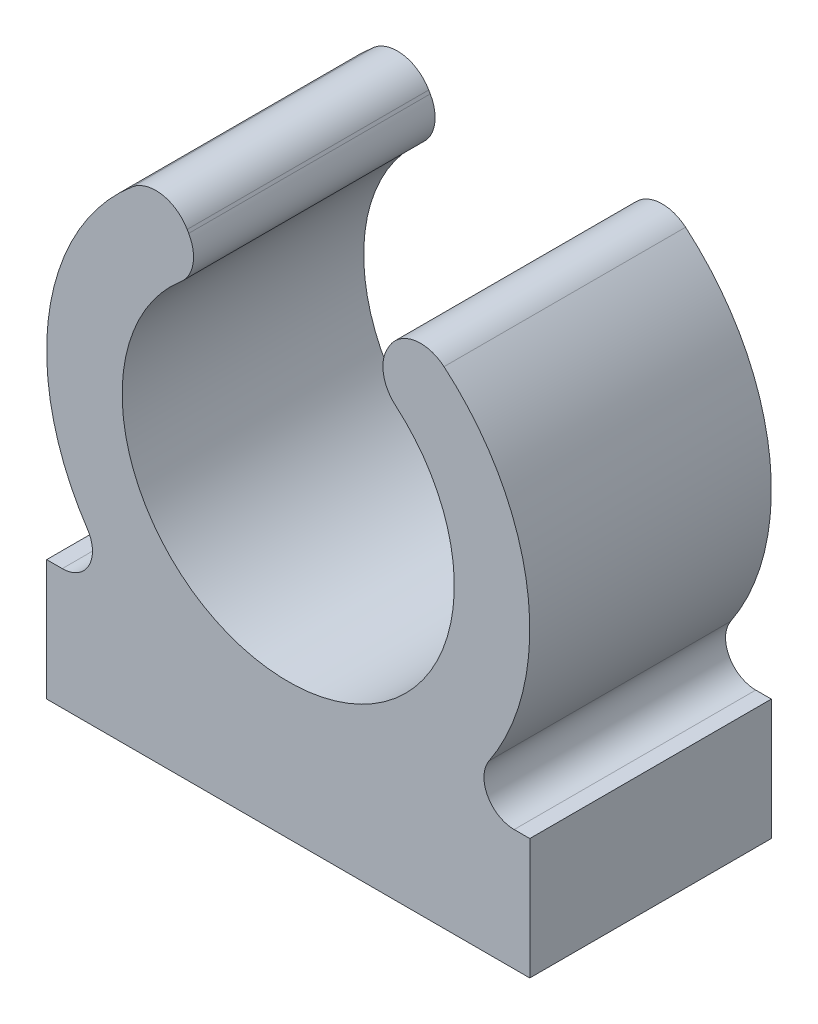
ISO-10303-21;
HEADER;
FILE_DESCRIPTION(('STEP AP214'),'2;1');
FILE_NAME('part.step','',(''),(''),'','','');
FILE_SCHEMA(('AUTOMOTIVE_DESIGN { 1 0 10303 214 1 1 1 1 }'));
ENDSEC;
DATA;
#1=APPLICATION_CONTEXT('core data for automotive mechanical design processes');
#2=APPLICATION_PROTOCOL_DEFINITION('international standard','automotive_design',2000,#1);
#3=PRODUCT_CONTEXT('',#1,'mechanical');
#4=PRODUCT('Part','Part','',(#3));
#5=PRODUCT_RELATED_PRODUCT_CATEGORY('part','',(#4));
#6=PRODUCT_DEFINITION_FORMATION('','',#4);
#7=PRODUCT_DEFINITION_CONTEXT('part definition',#1,'design');
#8=PRODUCT_DEFINITION('design','',#6,#7);
#9=PRODUCT_DEFINITION_SHAPE('','',#8);
#10=(LENGTH_UNIT() NAMED_UNIT(*) SI_UNIT(.MILLI.,.METRE.));
#11=(NAMED_UNIT(*) PLANE_ANGLE_UNIT() SI_UNIT($,.RADIAN.));
#12=(NAMED_UNIT(*) SI_UNIT($,.STERADIAN.) SOLID_ANGLE_UNIT());
#13=UNCERTAINTY_MEASURE_WITH_UNIT(LENGTH_MEASURE(1.E-05),#10,'distance_accuracy_value','');
#14=(GEOMETRIC_REPRESENTATION_CONTEXT(3) GLOBAL_UNCERTAINTY_ASSIGNED_CONTEXT((#13)) GLOBAL_UNIT_ASSIGNED_CONTEXT((#10,
#11,#12)) REPRESENTATION_CONTEXT('',''));
#15=CARTESIAN_POINT('',(0.,0.,0.));
#16=DIRECTION('',(0.,0.,1.));
#17=DIRECTION('',(1.,0.,0.));
#18=AXIS2_PLACEMENT_3D('',#15,#16,#17);
#19=CARTESIAN_POINT('',(0.,2.,0.));
#20=DIRECTION('',(0.,-1.,0.));
#21=DIRECTION('',(0.,0.,-1.));
#22=AXIS2_PLACEMENT_3D('',#19,#20,#21);
#23=PLANE('',#22);
#24=DIRECTION('',(-1.,0.,0.));
#25=VECTOR('',#24,1.);
#26=CARTESIAN_POINT('',(0.,2.,-4.));
#27=LINE('',#26,#25);
#28=CARTESIAN_POINT('',(8.,2.,-4.));
#29=VERTEX_POINT('',#28);
#30=CARTESIAN_POINT('',(7.74165738677394,2.,-4.));
#31=VERTEX_POINT('',#30);
#32=EDGE_CURVE('E251',#29,#31,#27,.T.);
#33=ORIENTED_EDGE('',*,*,#32,.T.);
#34=DIRECTION('',(0.,0.,1.));
#35=VECTOR('',#34,1.);
#36=CARTESIAN_POINT('',(7.74165738677394,2.,0.));
#37=LINE('',#36,#35);
#38=CARTESIAN_POINT('',(7.74165738677394,2.,0.));
#39=VERTEX_POINT('',#38);
#40=EDGE_CURVE('E291',#31,#39,#37,.T.);
#41=ORIENTED_EDGE('',*,*,#40,.T.);
#42=DIRECTION('',(1.,0.,0.));
#43=VECTOR('',#42,1.);
#44=CARTESIAN_POINT('',(0.,2.,0.));
#45=LINE('',#44,#43);
#46=CARTESIAN_POINT('',(8.,2.,0.));
#47=VERTEX_POINT('',#46);
#48=EDGE_CURVE('E241',#39,#47,#45,.T.);
#49=ORIENTED_EDGE('',*,*,#48,.T.);
#50=DIRECTION('',(0.,0.,-1.));
#51=VECTOR('',#50,1.);
#52=CARTESIAN_POINT('',(8.,2.,0.));
#53=LINE('',#52,#51);
#54=EDGE_CURVE('E246',#47,#29,#53,.T.);
#55=ORIENTED_EDGE('',*,*,#54,.T.);
#56=EDGE_LOOP('',(#33,#41,#49,#55));
#57=FACE_BOUND('',#56,.T.);
#58=ADVANCED_FACE('F47',(#57),#23,.F.);
#59=CARTESIAN_POINT('',(0.,1.,0.));
#60=DIRECTION('',(1.,0.,0.));
#61=DIRECTION('',(0.,0.,-1.));
#62=AXIS2_PLACEMENT_3D('',#59,#60,#61);
#63=PLANE('',#62);
#64=DIRECTION('',(0.,0.,1.));
#65=VECTOR('',#64,1.);
#66=CARTESIAN_POINT('',(0.,0.,0.));
#67=LINE('',#66,#65);
#68=CARTESIAN_POINT('',(0.,0.,-4.));
#69=VERTEX_POINT('',#68);
#70=CARTESIAN_POINT('',(0.,0.,0.));
#71=VERTEX_POINT('',#70);
#72=EDGE_CURVE('E255',#69,#71,#67,.T.);
#73=ORIENTED_EDGE('',*,*,#72,.T.);
#74=DIRECTION('',(0.,-1.,0.));
#75=VECTOR('',#74,1.);
#76=CARTESIAN_POINT('',(0.,1.,0.));
#77=LINE('',#76,#75);
#78=CARTESIAN_POINT('',(0.,2.,0.));
#79=VERTEX_POINT('',#78);
#80=EDGE_CURVE('E280',#79,#71,#77,.T.);
#81=ORIENTED_EDGE('',*,*,#80,.F.);
#82=DIRECTION('',(0.,0.,1.));
#83=VECTOR('',#82,1.);
#84=CARTESIAN_POINT('',(0.,2.,0.));
#85=LINE('',#84,#83);
#86=CARTESIAN_POINT('',(0.,2.,-4.));
#87=VERTEX_POINT('',#86);
#88=EDGE_CURVE('E237',#87,#79,#85,.T.);
#89=ORIENTED_EDGE('',*,*,#88,.F.);
#90=DIRECTION('',(0.,-1.,0.));
#91=VECTOR('',#90,1.);
#92=CARTESIAN_POINT('',(0.,1.,-4.));
#93=LINE('',#92,#91);
#94=EDGE_CURVE('E268',#87,#69,#93,.T.);
#95=ORIENTED_EDGE('',*,*,#94,.T.);
#96=EDGE_LOOP('',(#73,#81,#89,#95));
#97=FACE_BOUND('',#96,.T.);
#98=ADVANCED_FACE('F367',(#97),#63,.F.);
#99=CARTESIAN_POINT('',(0.,1.,0.));
#100=DIRECTION('',(0.,0.,-1.));
#101=DIRECTION('',(-1.,0.,0.));
#102=AXIS2_PLACEMENT_3D('',#99,#100,#101);
#103=PLANE('',#102);
#104=ORIENTED_EDGE('',*,*,#48,.F.);
#105=CARTESIAN_POINT('',(7.74165738677394,2.5,0.));
#106=DIRECTION('',(0.,0.,-1.));
#107=DIRECTION('',(-1.,0.,0.));
#108=AXIS2_PLACEMENT_3D('',#105,#106,#107);
#109=CIRCLE('',#108,0.5);
#110=CARTESIAN_POINT('',(7.32591767713239,2.77777777777778,0.));
#111=VERTEX_POINT('',#110);
#112=EDGE_CURVE('E56',#39,#111,#109,.T.);
#113=ORIENTED_EDGE('',*,*,#112,.T.);
#114=CARTESIAN_POINT('',(4.,5.,0.));
#115=DIRECTION('',(0.,0.,1.));
#116=DIRECTION('',(1.,0.,0.));
#117=AXIS2_PLACEMENT_3D('',#114,#115,#116);
#118=CIRCLE('',#117,4.);
#119=CARTESIAN_POINT('',(6.5799238768692,8.05679452851516,0.));
#120=VERTEX_POINT('',#119);
#121=EDGE_CURVE('E197',#111,#120,#118,.T.);
#122=ORIENTED_EDGE('',*,*,#121,.T.);
#123=CARTESIAN_POINT('',(6.19293529533882,7.59827534923789,0.));
#124=DIRECTION('',(0.,0.,1.));
#125=DIRECTION('',(1.,0.,0.));
#126=AXIS2_PLACEMENT_3D('',#123,#124,#125);
#127=CIRCLE('',#126,0.599999999999999);
#128=CARTESIAN_POINT('',(5.67332005306815,7.89827534923789,0.));
#129=VERTEX_POINT('',#128);
#130=EDGE_CURVE('E202',#129,#120,#127,.F.);
#131=ORIENTED_EDGE('',*,*,#130,.F.);
#132=DIRECTION('',(0.499999999999986,0.866025403784447,0.));
#133=VECTOR('',#132,1.);
#134=CARTESIAN_POINT('',(0.834936490539053,-0.482050807568945,0.));
#135=LINE('',#134,#133);
#136=CARTESIAN_POINT('',(5.6479153497677,7.85427311237029,0.));
#137=VERTEX_POINT('',#136);
#138=EDGE_CURVE('E206',#137,#129,#135,.T.);
#139=ORIENTED_EDGE('',*,*,#138,.F.);
#140=CARTESIAN_POINT('',(6.16753059203837,7.55427311237029,0.));
#141=DIRECTION('',(0.,0.,1.));
#142=DIRECTION('',(1.,0.,0.));
#143=AXIS2_PLACEMENT_3D('',#140,#141,#142);
#144=CIRCLE('',#143,0.599999999999999);
#145=CARTESIAN_POINT('',(5.77931615764343,7.09679136090098,0.));
#146=VERTEX_POINT('',#145);
#147=EDGE_CURVE('E173',#137,#146,#144,.T.);
#148=ORIENTED_EDGE('',*,*,#147,.T.);
#149=CARTESIAN_POINT('',(4.,5.,0.));
#150=DIRECTION('',(0.,0.,1.));
#151=DIRECTION('',(1.,0.,0.));
#152=AXIS2_PLACEMENT_3D('',#149,#150,#151);
#153=CIRCLE('',#152,2.75);
#154=CARTESIAN_POINT('',(2.22068384235657,7.09679136090098,0.));
#155=VERTEX_POINT('',#154);
#156=EDGE_CURVE('E165',#155,#146,#153,.T.);
#157=ORIENTED_EDGE('',*,*,#156,.F.);
#158=CARTESIAN_POINT('',(1.83246940796163,7.55427311237029,0.));
#159=DIRECTION('',(0.,0.,1.));
#160=DIRECTION('',(1.,0.,0.));
#161=AXIS2_PLACEMENT_3D('',#158,#159,#160);
#162=CIRCLE('',#161,0.6);
#163=CARTESIAN_POINT('',(2.3520846502323,7.85427311237029,0.));
#164=VERTEX_POINT('',#163);
#165=EDGE_CURVE('E178',#155,#164,#162,.T.);
#166=ORIENTED_EDGE('',*,*,#165,.T.);
#167=DIRECTION('',(-0.499999999999986,0.866025403784447,0.));
#168=VECTOR('',#167,1.);
#169=CARTESIAN_POINT('',(5.16506350946106,2.98205080756874,0.));
#170=LINE('',#169,#168);
#171=CARTESIAN_POINT('',(2.32667994693185,7.89827534923789,0.));
#172=VERTEX_POINT('',#171);
#173=EDGE_CURVE('E187',#164,#172,#170,.T.);
#174=ORIENTED_EDGE('',*,*,#173,.T.);
#175=CARTESIAN_POINT('',(1.80706470466118,7.59827534923789,0.));
#176=DIRECTION('',(0.,0.,1.));
#177=DIRECTION('',(1.,0.,0.));
#178=AXIS2_PLACEMENT_3D('',#175,#176,#177);
#179=CIRCLE('',#178,0.599999999999999);
#180=CARTESIAN_POINT('',(1.4200761231308,8.05679452851516,0.));
#181=VERTEX_POINT('',#180);
#182=EDGE_CURVE('E190',#172,#181,#179,.T.);
#183=ORIENTED_EDGE('',*,*,#182,.T.);
#184=CARTESIAN_POINT('',(0.674082322867607,2.77777777777778,0.));
#185=VERTEX_POINT('',#184);
#186=EDGE_CURVE('E198',#181,#185,#118,.T.);
#187=ORIENTED_EDGE('',*,*,#186,.T.);
#188=CARTESIAN_POINT('',(0.258342613226058,2.5,0.));
#189=DIRECTION('',(0.,0.,-1.));
#190=DIRECTION('',(-1.,0.,0.));
#191=AXIS2_PLACEMENT_3D('',#188,#189,#190);
#192=CIRCLE('',#191,0.5);
#193=CARTESIAN_POINT('',(0.258342613226058,2.,0.));
#194=VERTEX_POINT('',#193);
#195=EDGE_CURVE('E300',#185,#194,#192,.T.);
#196=ORIENTED_EDGE('',*,*,#195,.T.);
#197=EDGE_CURVE('E242',#79,#194,#45,.T.);
#198=ORIENTED_EDGE('',*,*,#197,.F.);
#199=ORIENTED_EDGE('',*,*,#80,.T.);
#200=DIRECTION('',(1.,0.,0.));
#201=VECTOR('',#200,1.);
#202=CARTESIAN_POINT('',(0.,0.,0.));
#203=LINE('',#202,#201);
#204=CARTESIAN_POINT('',(8.,0.,0.));
#205=VERTEX_POINT('',#204);
#206=EDGE_CURVE('E259',#71,#205,#203,.T.);
#207=ORIENTED_EDGE('',*,*,#206,.T.);
#208=DIRECTION('',(0.,-1.,0.));
#209=VECTOR('',#208,1.);
#210=CARTESIAN_POINT('',(8.,1.,0.));
#211=LINE('',#210,#209);
#212=EDGE_CURVE('E276',#47,#205,#211,.T.);
#213=ORIENTED_EDGE('',*,*,#212,.F.);
#214=EDGE_LOOP('',(#104,#113,#122,#131,#139,#148,#157,#166,#174,#183,#187,#196,#198,#199,#207,#213));
#215=FACE_BOUND('',#214,.T.);
#216=ADVANCED_FACE('F176',(#215),#103,.F.);
#217=CARTESIAN_POINT('',(8.,1.,0.));
#218=DIRECTION('',(-1.,0.,0.));
#219=DIRECTION('',(0.,0.,1.));
#220=AXIS2_PLACEMENT_3D('',#217,#218,#219);
#221=PLANE('',#220);
#222=DIRECTION('',(0.,0.,-1.));
#223=VECTOR('',#222,1.);
#224=CARTESIAN_POINT('',(8.,0.,0.));
#225=LINE('',#224,#223);
#226=CARTESIAN_POINT('',(8.,0.,-4.));
#227=VERTEX_POINT('',#226);
#228=EDGE_CURVE('E262',#205,#227,#225,.T.);
#229=ORIENTED_EDGE('',*,*,#228,.T.);
#230=DIRECTION('',(0.,-1.,0.));
#231=VECTOR('',#230,1.);
#232=CARTESIAN_POINT('',(8.,1.,-4.));
#233=LINE('',#232,#231);
#234=EDGE_CURVE('E272',#29,#227,#233,.T.);
#235=ORIENTED_EDGE('',*,*,#234,.F.);
#236=ORIENTED_EDGE('',*,*,#54,.F.);
#237=ORIENTED_EDGE('',*,*,#212,.T.);
#238=EDGE_LOOP('',(#229,#235,#236,#237));
#239=FACE_BOUND('',#238,.T.);
#240=ADVANCED_FACE('F374',(#239),#221,.F.);
#241=CARTESIAN_POINT('',(0.,1.,-4.));
#242=DIRECTION('',(0.,0.,1.));
#243=DIRECTION('',(1.,0.,0.));
#244=AXIS2_PLACEMENT_3D('',#241,#242,#243);
#245=PLANE('',#244);
#246=CARTESIAN_POINT('',(0.258342613226058,2.,-4.));
#247=VERTEX_POINT('',#246);
#248=EDGE_CURVE('E250',#247,#87,#27,.T.);
#249=ORIENTED_EDGE('',*,*,#248,.F.);
#250=CARTESIAN_POINT('',(0.258342613226058,2.5,-4.));
#251=DIRECTION('',(0.,0.,1.));
#252=DIRECTION('',(1.,0.,0.));
#253=AXIS2_PLACEMENT_3D('',#250,#251,#252);
#254=CIRCLE('',#253,0.5);
#255=CARTESIAN_POINT('',(0.674082322867607,2.77777777777778,-4.));
#256=VERTEX_POINT('',#255);
#257=EDGE_CURVE('E297',#247,#256,#254,.T.);
#258=ORIENTED_EDGE('',*,*,#257,.T.);
#259=CARTESIAN_POINT('',(4.,5.,-4.));
#260=DIRECTION('',(0.,0.,1.));
#261=DIRECTION('',(1.,0.,0.));
#262=AXIS2_PLACEMENT_3D('',#259,#260,#261);
#263=CIRCLE('',#262,4.);
#264=CARTESIAN_POINT('',(1.4200761231308,8.05679452851516,-4.));
#265=VERTEX_POINT('',#264);
#266=EDGE_CURVE('E320',#256,#265,#263,.F.);
#267=ORIENTED_EDGE('',*,*,#266,.T.);
#268=CARTESIAN_POINT('',(1.80706470466118,7.59827534923789,-4.));
#269=DIRECTION('',(0.,0.,1.));
#270=DIRECTION('',(1.,0.,0.));
#271=AXIS2_PLACEMENT_3D('',#268,#269,#270);
#272=CIRCLE('',#271,0.599999999999999);
#273=CARTESIAN_POINT('',(2.32667994693185,7.89827534923788,-4.));
#274=VERTEX_POINT('',#273);
#275=EDGE_CURVE('E323',#265,#274,#272,.F.);
#276=ORIENTED_EDGE('',*,*,#275,.T.);
#277=DIRECTION('',(0.499999999999986,-0.866025403784447,0.));
#278=VECTOR('',#277,1.);
#279=CARTESIAN_POINT('',(5.16506350946106,2.98205080756874,-4.));
#280=LINE('',#279,#278);
#281=CARTESIAN_POINT('',(2.3520846502323,7.85427311237029,-4.));
#282=VERTEX_POINT('',#281);
#283=EDGE_CURVE('E215',#274,#282,#280,.T.);
#284=ORIENTED_EDGE('',*,*,#283,.T.);
#285=CARTESIAN_POINT('',(1.83246940796163,7.55427311237029,-4.));
#286=DIRECTION('',(0.,0.,1.));
#287=DIRECTION('',(1.,0.,0.));
#288=AXIS2_PLACEMENT_3D('',#285,#286,#287);
#289=CIRCLE('',#288,0.6);
#290=CARTESIAN_POINT('',(2.22068384235657,7.09679136090098,-4.));
#291=VERTEX_POINT('',#290);
#292=EDGE_CURVE('E234',#282,#291,#289,.F.);
#293=ORIENTED_EDGE('',*,*,#292,.T.);
#294=CARTESIAN_POINT('',(4.,5.,-4.));
#295=DIRECTION('',(0.,0.,1.));
#296=DIRECTION('',(1.,0.,0.));
#297=AXIS2_PLACEMENT_3D('',#294,#295,#296);
#298=CIRCLE('',#297,2.75);
#299=CARTESIAN_POINT('',(5.77931615764343,7.09679136090098,-4.));
#300=VERTEX_POINT('',#299);
#301=EDGE_CURVE('E167',#300,#291,#298,.F.);
#302=ORIENTED_EDGE('',*,*,#301,.F.);
#303=CARTESIAN_POINT('',(6.16753059203837,7.55427311237029,-4.));
#304=DIRECTION('',(0.,0.,1.));
#305=DIRECTION('',(1.,0.,0.));
#306=AXIS2_PLACEMENT_3D('',#303,#304,#305);
#307=CIRCLE('',#306,0.599999999999999);
#308=CARTESIAN_POINT('',(5.6479153497677,7.85427311237029,-4.));
#309=VERTEX_POINT('',#308);
#310=EDGE_CURVE('E307',#300,#309,#307,.F.);
#311=ORIENTED_EDGE('',*,*,#310,.T.);
#312=DIRECTION('',(-0.499999999999986,-0.866025403784447,0.));
#313=VECTOR('',#312,1.);
#314=CARTESIAN_POINT('',(0.834936490539053,-0.482050807568945,-4.));
#315=LINE('',#314,#313);
#316=CARTESIAN_POINT('',(5.67332005306816,7.89827534923789,-4.));
#317=VERTEX_POINT('',#316);
#318=EDGE_CURVE('E309',#317,#309,#315,.T.);
#319=ORIENTED_EDGE('',*,*,#318,.F.);
#320=CARTESIAN_POINT('',(6.19293529533882,7.59827534923789,-4.));
#321=DIRECTION('',(0.,0.,1.));
#322=DIRECTION('',(1.,0.,0.));
#323=AXIS2_PLACEMENT_3D('',#320,#321,#322);
#324=CIRCLE('',#323,0.599999999999999);
#325=CARTESIAN_POINT('',(6.5799238768692,8.05679452851516,-4.));
#326=VERTEX_POINT('',#325);
#327=EDGE_CURVE('E313',#326,#317,#324,.T.);
#328=ORIENTED_EDGE('',*,*,#327,.F.);
#329=CARTESIAN_POINT('',(7.32591767713239,2.77777777777778,-4.));
#330=VERTEX_POINT('',#329);
#331=EDGE_CURVE('E317',#326,#330,#263,.F.);
#332=ORIENTED_EDGE('',*,*,#331,.T.);
#333=CARTESIAN_POINT('',(7.74165738677394,2.5,-4.));
#334=DIRECTION('',(0.,0.,1.));
#335=DIRECTION('',(1.,0.,0.));
#336=AXIS2_PLACEMENT_3D('',#333,#334,#335);
#337=CIRCLE('',#336,0.5);
#338=EDGE_CURVE('E11',#330,#31,#337,.T.);
#339=ORIENTED_EDGE('',*,*,#338,.T.);
#340=ORIENTED_EDGE('',*,*,#32,.F.);
#341=ORIENTED_EDGE('',*,*,#234,.T.);
#342=DIRECTION('',(-1.,0.,0.));
#343=VECTOR('',#342,1.);
#344=CARTESIAN_POINT('',(0.,0.,-4.));
#345=LINE('',#344,#343);
#346=EDGE_CURVE('E265',#227,#69,#345,.T.);
#347=ORIENTED_EDGE('',*,*,#346,.T.);
#348=ORIENTED_EDGE('',*,*,#94,.F.);
#349=EDGE_LOOP('',(#249,#258,#267,#276,#284,#293,#302,#311,#319,#328,#332,#339,#340,#341,#347,#348));
#350=FACE_BOUND('',#349,.T.);
#351=ADVANCED_FACE('F342',(#350),#245,.F.);
#352=CARTESIAN_POINT('',(0.,0.,0.));
#353=DIRECTION('',(0.,-1.,0.));
#354=DIRECTION('',(0.,0.,-1.));
#355=AXIS2_PLACEMENT_3D('',#352,#353,#354);
#356=PLANE('',#355);
#357=ORIENTED_EDGE('',*,*,#72,.F.);
#358=ORIENTED_EDGE('',*,*,#346,.F.);
#359=ORIENTED_EDGE('',*,*,#228,.F.);
#360=ORIENTED_EDGE('',*,*,#206,.F.);
#361=EDGE_LOOP('',(#357,#358,#359,#360));
#362=FACE_BOUND('',#361,.T.);
#363=ADVANCED_FACE('F376',(#362),#356,.T.);
#364=ORIENTED_EDGE('',*,*,#197,.T.);
#365=DIRECTION('',(0.,0.,1.));
#366=VECTOR('',#365,1.);
#367=CARTESIAN_POINT('',(0.258342613226058,2.,0.));
#368=LINE('',#367,#366);
#369=EDGE_CURVE('E284',#194,#247,#368,.F.);
#370=ORIENTED_EDGE('',*,*,#369,.T.);
#371=ORIENTED_EDGE('',*,*,#248,.T.);
#372=ORIENTED_EDGE('',*,*,#88,.T.);
#373=EDGE_LOOP('',(#364,#370,#371,#372));
#374=FACE_BOUND('',#373,.T.);
#375=ADVANCED_FACE('F363',(#374),#23,.F.);
#376=CARTESIAN_POINT('',(4.,5.,-14.7617455834751));
#377=DIRECTION('',(0.,0.,1.));
#378=DIRECTION('',(1.,0.,0.));
#379=AXIS2_PLACEMENT_3D('',#376,#377,#378);
#380=CYLINDRICAL_SURFACE('',#379,4.);
#381=ORIENTED_EDGE('',*,*,#121,.F.);
#382=DIRECTION('',(0.,0.,1.));
#383=VECTOR('',#382,1.);
#384=CARTESIAN_POINT('',(7.32591767713239,2.77777777777778,-14.7617455834751));
#385=LINE('',#384,#383);
#386=EDGE_CURVE('E69',#111,#330,#385,.F.);
#387=ORIENTED_EDGE('',*,*,#386,.T.);
#388=ORIENTED_EDGE('',*,*,#331,.F.);
#389=DIRECTION('',(0.,0.,1.));
#390=VECTOR('',#389,1.);
#391=CARTESIAN_POINT('',(6.5799238768692,8.05679452851516,-14.7617455834751));
#392=LINE('',#391,#390);
#393=EDGE_CURVE('E222',#326,#120,#392,.T.);
#394=ORIENTED_EDGE('',*,*,#393,.T.);
#395=EDGE_LOOP('',(#381,#387,#388,#394));
#396=FACE_BOUND('',#395,.T.);
#397=ADVANCED_FACE('F330',(#396),#380,.T.);
#398=ORIENTED_EDGE('',*,*,#266,.F.);
#399=DIRECTION('',(0.,0.,1.));
#400=VECTOR('',#399,1.);
#401=CARTESIAN_POINT('',(0.674082322867607,2.77777777777778,-14.7617455834751));
#402=LINE('',#401,#400);
#403=EDGE_CURVE('E288',#256,#185,#402,.T.);
#404=ORIENTED_EDGE('',*,*,#403,.T.);
#405=ORIENTED_EDGE('',*,*,#186,.F.);
#406=DIRECTION('',(0.,0.,1.));
#407=VECTOR('',#406,1.);
#408=CARTESIAN_POINT('',(1.4200761231308,8.05679452851516,-14.7617455834751));
#409=LINE('',#408,#407);
#410=EDGE_CURVE('E226',#265,#181,#409,.T.);
#411=ORIENTED_EDGE('',*,*,#410,.F.);
#412=EDGE_LOOP('',(#398,#404,#405,#411));
#413=FACE_BOUND('',#412,.T.);
#414=ADVANCED_FACE('F356',(#413),#380,.T.);
#415=CARTESIAN_POINT('',(4.,5.,-14.7617455834751));
#416=DIRECTION('',(0.,0.,1.));
#417=DIRECTION('',(1.,0.,0.));
#418=AXIS2_PLACEMENT_3D('',#415,#416,#417);
#419=CYLINDRICAL_SURFACE('',#418,2.75);
#420=DIRECTION('',(0.,0.,1.));
#421=VECTOR('',#420,1.);
#422=CARTESIAN_POINT('',(5.77931615764343,7.09679136090098,-14.7617455834751));
#423=LINE('',#422,#421);
#424=EDGE_CURVE('E212',#300,#146,#423,.T.);
#425=ORIENTED_EDGE('',*,*,#424,.F.);
#426=ORIENTED_EDGE('',*,*,#301,.T.);
#427=DIRECTION('',(0.,0.,1.));
#428=VECTOR('',#427,1.);
#429=CARTESIAN_POINT('',(2.22068384235657,7.09679136090098,-14.7617455834751));
#430=LINE('',#429,#428);
#431=EDGE_CURVE('E161',#291,#155,#430,.T.);
#432=ORIENTED_EDGE('',*,*,#431,.T.);
#433=ORIENTED_EDGE('',*,*,#156,.T.);
#434=EDGE_LOOP('',(#425,#426,#432,#433));
#435=FACE_BOUND('',#434,.T.);
#436=ADVANCED_FACE('F164',(#435),#419,.F.);
#437=CARTESIAN_POINT('',(6.16753059203837,7.55427311237029,-14.7617455834751));
#438=DIRECTION('',(0.,0.,1.));
#439=DIRECTION('',(1.,0.,0.));
#440=AXIS2_PLACEMENT_3D('',#437,#438,#439);
#441=CYLINDRICAL_SURFACE('',#440,0.599999999999999);
#442=ORIENTED_EDGE('',*,*,#310,.F.);
#443=ORIENTED_EDGE('',*,*,#424,.T.);
#444=ORIENTED_EDGE('',*,*,#147,.F.);
#445=DIRECTION('',(0.,0.,1.));
#446=VECTOR('',#445,1.);
#447=CARTESIAN_POINT('',(5.6479153497677,7.85427311237029,-14.7617455834751));
#448=LINE('',#447,#446);
#449=EDGE_CURVE('E216',#309,#137,#448,.T.);
#450=ORIENTED_EDGE('',*,*,#449,.F.);
#451=EDGE_LOOP('',(#442,#443,#444,#450));
#452=FACE_BOUND('',#451,.T.);
#453=ADVANCED_FACE('F339',(#452),#441,.T.);
#454=CARTESIAN_POINT('',(0.834936490539053,-0.482050807568945,-14.7617455834751));
#455=DIRECTION('',(0.866025403784447,-0.499999999999986,0.));
#456=DIRECTION('',(0.499999999999986,0.866025403784447,0.));
#457=AXIS2_PLACEMENT_3D('',#454,#455,#456);
#458=PLANE('',#457);
#459=DIRECTION('',(0.,0.,1.));
#460=VECTOR('',#459,1.);
#461=CARTESIAN_POINT('',(5.67332005306815,7.89827534923789,-14.7617455834751));
#462=LINE('',#461,#460);
#463=EDGE_CURVE('E219',#317,#129,#462,.T.);
#464=ORIENTED_EDGE('',*,*,#463,.F.);
#465=ORIENTED_EDGE('',*,*,#318,.T.);
#466=ORIENTED_EDGE('',*,*,#449,.T.);
#467=ORIENTED_EDGE('',*,*,#138,.T.);
#468=EDGE_LOOP('',(#464,#465,#466,#467));
#469=FACE_BOUND('',#468,.T.);
#470=ADVANCED_FACE('F335',(#469),#458,.F.);
#471=CARTESIAN_POINT('',(6.19293529533882,7.59827534923789,-14.7617455834751));
#472=DIRECTION('',(0.,0.,1.));
#473=DIRECTION('',(1.,0.,0.));
#474=AXIS2_PLACEMENT_3D('',#471,#472,#473);
#475=CYLINDRICAL_SURFACE('',#474,0.599999999999999);
#476=ORIENTED_EDGE('',*,*,#393,.F.);
#477=ORIENTED_EDGE('',*,*,#327,.T.);
#478=ORIENTED_EDGE('',*,*,#463,.T.);
#479=ORIENTED_EDGE('',*,*,#130,.T.);
#480=EDGE_LOOP('',(#476,#477,#478,#479));
#481=FACE_BOUND('',#480,.T.);
#482=ADVANCED_FACE('F332',(#481),#475,.T.);
#483=CARTESIAN_POINT('',(1.80706470466118,7.59827534923789,-14.7617455834751));
#484=DIRECTION('',(0.,0.,1.));
#485=DIRECTION('',(1.,0.,0.));
#486=AXIS2_PLACEMENT_3D('',#483,#484,#485);
#487=CYLINDRICAL_SURFACE('',#486,0.599999999999999);
#488=ORIENTED_EDGE('',*,*,#275,.F.);
#489=ORIENTED_EDGE('',*,*,#410,.T.);
#490=ORIENTED_EDGE('',*,*,#182,.F.);
#491=DIRECTION('',(0.,0.,1.));
#492=VECTOR('',#491,1.);
#493=CARTESIAN_POINT('',(2.32667994693185,7.89827534923789,-14.7617455834751));
#494=LINE('',#493,#492);
#495=EDGE_CURVE('E229',#274,#172,#494,.T.);
#496=ORIENTED_EDGE('',*,*,#495,.F.);
#497=EDGE_LOOP('',(#488,#489,#490,#496));
#498=FACE_BOUND('',#497,.T.);
#499=ADVANCED_FACE('F352',(#498),#487,.T.);
#500=CARTESIAN_POINT('',(5.16506350946106,2.98205080756874,-14.7617455834751));
#501=DIRECTION('',(0.866025403784447,0.499999999999986,0.));
#502=DIRECTION('',(-0.499999999999986,0.866025403784447,0.));
#503=AXIS2_PLACEMENT_3D('',#500,#501,#502);
#504=PLANE('',#503);
#505=ORIENTED_EDGE('',*,*,#283,.F.);
#506=ORIENTED_EDGE('',*,*,#495,.T.);
#507=ORIENTED_EDGE('',*,*,#173,.F.);
#508=DIRECTION('',(0.,0.,1.));
#509=VECTOR('',#508,1.);
#510=CARTESIAN_POINT('',(2.3520846502323,7.85427311237029,-14.7617455834751));
#511=LINE('',#510,#509);
#512=EDGE_CURVE('E172',#282,#164,#511,.T.);
#513=ORIENTED_EDGE('',*,*,#512,.F.);
#514=EDGE_LOOP('',(#505,#506,#507,#513));
#515=FACE_BOUND('',#514,.T.);
#516=ADVANCED_FACE('F347',(#515),#504,.T.);
#517=CARTESIAN_POINT('',(1.83246940796163,7.55427311237029,-14.7617455834751));
#518=DIRECTION('',(0.,0.,1.));
#519=DIRECTION('',(1.,0.,0.));
#520=AXIS2_PLACEMENT_3D('',#517,#518,#519);
#521=CYLINDRICAL_SURFACE('',#520,0.6);
#522=ORIENTED_EDGE('',*,*,#292,.F.);
#523=ORIENTED_EDGE('',*,*,#512,.T.);
#524=ORIENTED_EDGE('',*,*,#165,.F.);
#525=ORIENTED_EDGE('',*,*,#431,.F.);
#526=EDGE_LOOP('',(#522,#523,#524,#525));
#527=FACE_BOUND('',#526,.T.);
#528=ADVANCED_FACE('F183',(#527),#521,.T.);
#529=CARTESIAN_POINT('',(0.258342613226058,2.5,-14.7617455834751));
#530=DIRECTION('',(0.,0.,1.));
#531=DIRECTION('',(1.,0.,0.));
#532=AXIS2_PLACEMENT_3D('',#529,#530,#531);
#533=CYLINDRICAL_SURFACE('',#532,0.5);
#534=ORIENTED_EDGE('',*,*,#195,.F.);
#535=ORIENTED_EDGE('',*,*,#403,.F.);
#536=ORIENTED_EDGE('',*,*,#257,.F.);
#537=ORIENTED_EDGE('',*,*,#369,.F.);
#538=EDGE_LOOP('',(#534,#535,#536,#537));
#539=FACE_BOUND('',#538,.T.);
#540=ADVANCED_FACE('F359',(#539),#533,.F.);
#541=CARTESIAN_POINT('',(7.74165738677394,2.5,-14.7617455834751));
#542=DIRECTION('',(0.,0.,1.));
#543=DIRECTION('',(1.,0.,0.));
#544=AXIS2_PLACEMENT_3D('',#541,#542,#543);
#545=CYLINDRICAL_SURFACE('',#544,0.5);
#546=ORIENTED_EDGE('',*,*,#338,.F.);
#547=ORIENTED_EDGE('',*,*,#386,.F.);
#548=ORIENTED_EDGE('',*,*,#112,.F.);
#549=ORIENTED_EDGE('',*,*,#40,.F.);
#550=EDGE_LOOP('',(#546,#547,#548,#549));
#551=FACE_BOUND('',#550,.T.);
#552=ADVANCED_FACE('F49',(#551),#545,.F.);
#553=CLOSED_SHELL('',(#58,#98,#216,#240,#351,#363,#375,#397,#414,#436,#453,#470,#482,#499,#516,
#528,#540,#552));
#554=MANIFOLD_SOLID_BREP('B2',#553);
#555=ADVANCED_BREP_SHAPE_REPRESENTATION('',(#18,#554),#14);
#556=SHAPE_DEFINITION_REPRESENTATION(#9,#555);
ENDSEC;
END-ISO-10303-21;
